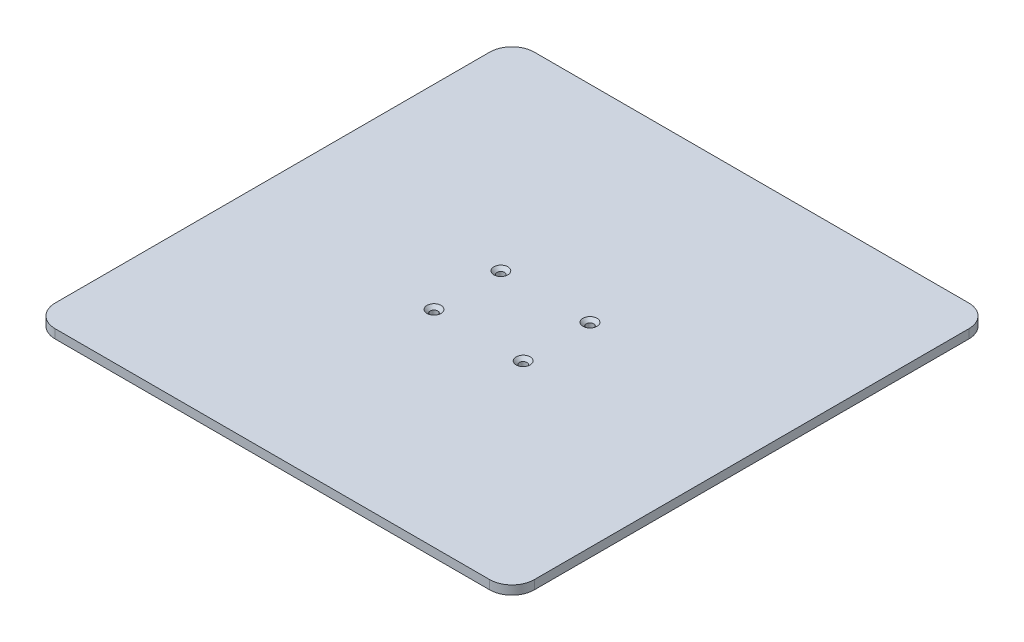
ISO-10303-21;
HEADER;
FILE_DESCRIPTION(('STEP AP214'),'2;1');
FILE_NAME('part.step','',(''),(''),'','','');
FILE_SCHEMA(('AUTOMOTIVE_DESIGN { 1 0 10303 214 1 1 1 1 }'));
ENDSEC;
DATA;
#1=APPLICATION_CONTEXT('core data for automotive mechanical design processes');
#2=APPLICATION_PROTOCOL_DEFINITION('international standard','automotive_design',2000,#1);
#3=PRODUCT_CONTEXT('',#1,'mechanical');
#4=PRODUCT('Part','Part','',(#3));
#5=PRODUCT_RELATED_PRODUCT_CATEGORY('part','',(#4));
#6=PRODUCT_DEFINITION_FORMATION('','',#4);
#7=PRODUCT_DEFINITION_CONTEXT('part definition',#1,'design');
#8=PRODUCT_DEFINITION('design','',#6,#7);
#9=PRODUCT_DEFINITION_SHAPE('','',#8);
#10=(LENGTH_UNIT() NAMED_UNIT(*) SI_UNIT(.MILLI.,.METRE.));
#11=(NAMED_UNIT(*) PLANE_ANGLE_UNIT() SI_UNIT($,.RADIAN.));
#12=(NAMED_UNIT(*) SI_UNIT($,.STERADIAN.) SOLID_ANGLE_UNIT());
#13=UNCERTAINTY_MEASURE_WITH_UNIT(LENGTH_MEASURE(1.E-05),#10,'distance_accuracy_value','');
#14=(GEOMETRIC_REPRESENTATION_CONTEXT(3) GLOBAL_UNCERTAINTY_ASSIGNED_CONTEXT((#13)) GLOBAL_UNIT_ASSIGNED_CONTEXT((#10,
#11,#12)) REPRESENTATION_CONTEXT('',''));
#15=CARTESIAN_POINT('',(0.,0.,0.));
#16=DIRECTION('',(0.,0.,1.));
#17=DIRECTION('',(1.,0.,0.));
#18=AXIS2_PLACEMENT_3D('',#15,#16,#17);
#19=CARTESIAN_POINT('',(107.5,2.,107.5));
#20=DIRECTION('',(-1.,0.,0.));
#21=DIRECTION('',(0.,0.,1.));
#22=AXIS2_PLACEMENT_3D('',#19,#20,#21);
#23=PLANE('',#22);
#24=DIRECTION('',(0.,0.,-1.));
#25=VECTOR('',#24,1.);
#26=CARTESIAN_POINT('',(107.5,2.,107.5));
#27=LINE('',#26,#25);
#28=CARTESIAN_POINT('',(107.5,2.,97.5));
#29=VERTEX_POINT('',#28);
#30=CARTESIAN_POINT('',(107.5,2.,-97.5));
#31=VERTEX_POINT('',#30);
#32=EDGE_CURVE('E139',#29,#31,#27,.T.);
#33=ORIENTED_EDGE('',*,*,#32,.F.);
#34=DIRECTION('',(0.,-1.,0.));
#35=VECTOR('',#34,1.);
#36=CARTESIAN_POINT('',(107.5,2.,97.5));
#37=LINE('',#36,#35);
#38=CARTESIAN_POINT('',(107.5,-2.,97.5));
#39=VERTEX_POINT('',#38);
#40=EDGE_CURVE('E178',#29,#39,#37,.T.);
#41=ORIENTED_EDGE('',*,*,#40,.T.);
#42=DIRECTION('',(0.,0.,-1.));
#43=VECTOR('',#42,1.);
#44=CARTESIAN_POINT('',(107.5,-2.,107.5));
#45=LINE('',#44,#43);
#46=CARTESIAN_POINT('',(107.5,-2.,-97.5));
#47=VERTEX_POINT('',#46);
#48=EDGE_CURVE('E193',#39,#47,#45,.T.);
#49=ORIENTED_EDGE('',*,*,#48,.T.);
#50=DIRECTION('',(0.,-1.,0.));
#51=VECTOR('',#50,1.);
#52=CARTESIAN_POINT('',(107.5,2.,-97.5));
#53=LINE('',#52,#51);
#54=EDGE_CURVE('E175',#47,#31,#53,.F.);
#55=ORIENTED_EDGE('',*,*,#54,.T.);
#56=EDGE_LOOP('',(#33,#41,#49,#55));
#57=FACE_BOUND('',#56,.T.);
#58=ADVANCED_FACE('F43',(#57),#23,.F.);
#59=CARTESIAN_POINT('',(-107.5,2.,-107.5));
#60=DIRECTION('',(0.,0.,1.));
#61=DIRECTION('',(1.,0.,0.));
#62=AXIS2_PLACEMENT_3D('',#59,#60,#61);
#63=PLANE('',#62);
#64=DIRECTION('',(-1.,0.,0.));
#65=VECTOR('',#64,1.);
#66=CARTESIAN_POINT('',(-107.5,2.,-107.5));
#67=LINE('',#66,#65);
#68=CARTESIAN_POINT('',(97.5,2.,-107.5));
#69=VERTEX_POINT('',#68);
#70=CARTESIAN_POINT('',(-97.5,2.,-107.5));
#71=VERTEX_POINT('',#70);
#72=EDGE_CURVE('E144',#69,#71,#67,.T.);
#73=ORIENTED_EDGE('',*,*,#72,.F.);
#74=DIRECTION('',(0.,-1.,0.));
#75=VECTOR('',#74,1.);
#76=CARTESIAN_POINT('',(97.5,2.,-107.5));
#77=LINE('',#76,#75);
#78=CARTESIAN_POINT('',(97.5,-2.,-107.5));
#79=VERTEX_POINT('',#78);
#80=EDGE_CURVE('E11',#69,#79,#77,.T.);
#81=ORIENTED_EDGE('',*,*,#80,.T.);
#82=DIRECTION('',(-1.,0.,0.));
#83=VECTOR('',#82,1.);
#84=CARTESIAN_POINT('',(-107.5,-2.,-107.5));
#85=LINE('',#84,#83);
#86=CARTESIAN_POINT('',(-97.5,-2.,-107.5));
#87=VERTEX_POINT('',#86);
#88=EDGE_CURVE('E146',#79,#87,#85,.T.);
#89=ORIENTED_EDGE('',*,*,#88,.T.);
#90=DIRECTION('',(0.,-1.,0.));
#91=VECTOR('',#90,1.);
#92=CARTESIAN_POINT('',(-97.5,2.,-107.5));
#93=LINE('',#92,#91);
#94=EDGE_CURVE('E52',#87,#71,#93,.F.);
#95=ORIENTED_EDGE('',*,*,#94,.T.);
#96=EDGE_LOOP('',(#73,#81,#89,#95));
#97=FACE_BOUND('',#96,.T.);
#98=ADVANCED_FACE('F199',(#97),#63,.F.);
#99=CARTESIAN_POINT('',(-107.5,2.,107.5));
#100=DIRECTION('',(1.,0.,0.));
#101=DIRECTION('',(0.,0.,-1.));
#102=AXIS2_PLACEMENT_3D('',#99,#100,#101);
#103=PLANE('',#102);
#104=DIRECTION('',(0.,0.,1.));
#105=VECTOR('',#104,1.);
#106=CARTESIAN_POINT('',(-107.5,-2.,107.5));
#107=LINE('',#106,#105);
#108=CARTESIAN_POINT('',(-107.5,-2.,-97.5));
#109=VERTEX_POINT('',#108);
#110=CARTESIAN_POINT('',(-107.5,-2.,97.5));
#111=VERTEX_POINT('',#110);
#112=EDGE_CURVE('E140',#109,#111,#107,.T.);
#113=ORIENTED_EDGE('',*,*,#112,.T.);
#114=DIRECTION('',(0.,-1.,0.));
#115=VECTOR('',#114,1.);
#116=CARTESIAN_POINT('',(-107.5,2.,97.5));
#117=LINE('',#116,#115);
#118=CARTESIAN_POINT('',(-107.5,2.,97.5));
#119=VERTEX_POINT('',#118);
#120=EDGE_CURVE('E115',#111,#119,#117,.F.);
#121=ORIENTED_EDGE('',*,*,#120,.T.);
#122=DIRECTION('',(0.,0.,1.));
#123=VECTOR('',#122,1.);
#124=CARTESIAN_POINT('',(-107.5,2.,107.5));
#125=LINE('',#124,#123);
#126=CARTESIAN_POINT('',(-107.5,2.,-97.5));
#127=VERTEX_POINT('',#126);
#128=EDGE_CURVE('E184',#127,#119,#125,.T.);
#129=ORIENTED_EDGE('',*,*,#128,.F.);
#130=DIRECTION('',(0.,-1.,0.));
#131=VECTOR('',#130,1.);
#132=CARTESIAN_POINT('',(-107.5,2.,-97.5));
#133=LINE('',#132,#131);
#134=EDGE_CURVE('E121',#127,#109,#133,.T.);
#135=ORIENTED_EDGE('',*,*,#134,.T.);
#136=EDGE_LOOP('',(#113,#121,#129,#135));
#137=FACE_BOUND('',#136,.T.);
#138=ADVANCED_FACE('F206',(#137),#103,.F.);
#139=CARTESIAN_POINT('',(-107.5,2.,107.5));
#140=DIRECTION('',(0.,0.,-1.));
#141=DIRECTION('',(-1.,0.,0.));
#142=AXIS2_PLACEMENT_3D('',#139,#140,#141);
#143=PLANE('',#142);
#144=DIRECTION('',(1.,0.,0.));
#145=VECTOR('',#144,1.);
#146=CARTESIAN_POINT('',(-107.5,2.,107.5));
#147=LINE('',#146,#145);
#148=CARTESIAN_POINT('',(-97.5,2.,107.5));
#149=VERTEX_POINT('',#148);
#150=CARTESIAN_POINT('',(97.5,2.,107.5));
#151=VERTEX_POINT('',#150);
#152=EDGE_CURVE('E131',#149,#151,#147,.T.);
#153=ORIENTED_EDGE('',*,*,#152,.F.);
#154=DIRECTION('',(0.,-1.,0.));
#155=VECTOR('',#154,1.);
#156=CARTESIAN_POINT('',(-97.5,2.,107.5));
#157=LINE('',#156,#155);
#158=CARTESIAN_POINT('',(-97.5,-2.,107.5));
#159=VERTEX_POINT('',#158);
#160=EDGE_CURVE('E114',#149,#159,#157,.T.);
#161=ORIENTED_EDGE('',*,*,#160,.T.);
#162=DIRECTION('',(1.,0.,0.));
#163=VECTOR('',#162,1.);
#164=CARTESIAN_POINT('',(-107.5,-2.,107.5));
#165=LINE('',#164,#163);
#166=CARTESIAN_POINT('',(97.5,-2.,107.5));
#167=VERTEX_POINT('',#166);
#168=EDGE_CURVE('E128',#159,#167,#165,.T.);
#169=ORIENTED_EDGE('',*,*,#168,.T.);
#170=DIRECTION('',(0.,-1.,0.));
#171=VECTOR('',#170,1.);
#172=CARTESIAN_POINT('',(97.5,2.,107.5));
#173=LINE('',#172,#171);
#174=EDGE_CURVE('E134',#167,#151,#173,.F.);
#175=ORIENTED_EDGE('',*,*,#174,.T.);
#176=EDGE_LOOP('',(#153,#161,#169,#175));
#177=FACE_BOUND('',#176,.T.);
#178=ADVANCED_FACE('F127',(#177),#143,.F.);
#179=CARTESIAN_POINT('',(0.,2.,0.));
#180=DIRECTION('',(0.,-1.,0.));
#181=DIRECTION('',(0.,0.,-1.));
#182=AXIS2_PLACEMENT_3D('',#179,#180,#181);
#183=PLANE('',#182);
#184=CARTESIAN_POINT('',(-20.,2.,-15.));
#185=DIRECTION('',(0.,1.,0.));
#186=DIRECTION('',(0.,0.,1.));
#187=AXIS2_PLACEMENT_3D('',#184,#185,#186);
#188=CIRCLE('',#187,3.15);
#189=CARTESIAN_POINT('',(-20.,2.,-11.85));
#190=VERTEX_POINT('',#189);
#191=EDGE_CURVE('E459',#190,#190,#188,.T.);
#192=ORIENTED_EDGE('',*,*,#191,.F.);
#193=EDGE_LOOP('',(#192));
#194=FACE_BOUND('',#193,.T.);
#195=CARTESIAN_POINT('',(20.,2.,-15.));
#196=DIRECTION('',(0.,1.,0.));
#197=DIRECTION('',(0.,0.,1.));
#198=AXIS2_PLACEMENT_3D('',#195,#196,#197);
#199=CIRCLE('',#198,3.15);
#200=CARTESIAN_POINT('',(20.,2.,-11.85));
#201=VERTEX_POINT('',#200);
#202=EDGE_CURVE('E447',#201,#201,#199,.T.);
#203=ORIENTED_EDGE('',*,*,#202,.F.);
#204=EDGE_LOOP('',(#203));
#205=FACE_BOUND('',#204,.T.);
#206=CARTESIAN_POINT('',(20.,2.,15.));
#207=DIRECTION('',(0.,1.,0.));
#208=DIRECTION('',(0.,0.,1.));
#209=AXIS2_PLACEMENT_3D('',#206,#207,#208);
#210=CIRCLE('',#209,3.15);
#211=CARTESIAN_POINT('',(20.,2.,18.15));
#212=VERTEX_POINT('',#211);
#213=EDGE_CURVE('E435',#212,#212,#210,.T.);
#214=ORIENTED_EDGE('',*,*,#213,.F.);
#215=EDGE_LOOP('',(#214));
#216=FACE_BOUND('',#215,.T.);
#217=CARTESIAN_POINT('',(-20.,2.,15.));
#218=DIRECTION('',(0.,1.,0.));
#219=DIRECTION('',(0.,0.,1.));
#220=AXIS2_PLACEMENT_3D('',#217,#218,#219);
#221=CIRCLE('',#220,3.15);
#222=CARTESIAN_POINT('',(-20.,2.,18.15));
#223=VERTEX_POINT('',#222);
#224=EDGE_CURVE('E421',#223,#223,#221,.T.);
#225=ORIENTED_EDGE('',*,*,#224,.F.);
#226=EDGE_LOOP('',(#225));
#227=FACE_BOUND('',#226,.T.);
#228=ORIENTED_EDGE('',*,*,#128,.T.);
#229=CARTESIAN_POINT('',(-97.5,2.,97.5));
#230=DIRECTION('',(0.,-1.,0.));
#231=DIRECTION('',(0.,0.,-1.));
#232=AXIS2_PLACEMENT_3D('',#229,#230,#231);
#233=CIRCLE('',#232,10.);
#234=EDGE_CURVE('E172',#119,#149,#233,.F.);
#235=ORIENTED_EDGE('',*,*,#234,.T.);
#236=ORIENTED_EDGE('',*,*,#152,.T.);
#237=CARTESIAN_POINT('',(97.5,2.,97.5));
#238=DIRECTION('',(0.,-1.,0.));
#239=DIRECTION('',(0.,0.,-1.));
#240=AXIS2_PLACEMENT_3D('',#237,#238,#239);
#241=CIRCLE('',#240,10.);
#242=EDGE_CURVE('E169',#151,#29,#241,.F.);
#243=ORIENTED_EDGE('',*,*,#242,.T.);
#244=ORIENTED_EDGE('',*,*,#32,.T.);
#245=CARTESIAN_POINT('',(97.5,2.,-97.5));
#246=DIRECTION('',(0.,-1.,0.));
#247=DIRECTION('',(0.,0.,-1.));
#248=AXIS2_PLACEMENT_3D('',#245,#246,#247);
#249=CIRCLE('',#248,10.);
#250=EDGE_CURVE('E65',#31,#69,#249,.F.);
#251=ORIENTED_EDGE('',*,*,#250,.T.);
#252=ORIENTED_EDGE('',*,*,#72,.T.);
#253=CARTESIAN_POINT('',(-97.5,2.,-97.5));
#254=DIRECTION('',(0.,-1.,0.));
#255=DIRECTION('',(0.,0.,-1.));
#256=AXIS2_PLACEMENT_3D('',#253,#254,#255);
#257=CIRCLE('',#256,10.);
#258=EDGE_CURVE('E164',#71,#127,#257,.F.);
#259=ORIENTED_EDGE('',*,*,#258,.T.);
#260=EDGE_LOOP('',(#228,#235,#236,#243,#244,#251,#252,#259));
#261=FACE_BOUND('',#260,.T.);
#262=ADVANCED_FACE('F204',(#194,#205,#216,#227,#261),#183,.F.);
#263=CARTESIAN_POINT('',(0.,-2.,0.));
#264=DIRECTION('',(0.,-1.,0.));
#265=DIRECTION('',(0.,0.,-1.));
#266=AXIS2_PLACEMENT_3D('',#263,#264,#265);
#267=PLANE('',#266);
#268=CARTESIAN_POINT('',(-20.,-2.,-15.));
#269=DIRECTION('',(0.,-1.,0.));
#270=DIRECTION('',(0.,0.,-1.));
#271=AXIS2_PLACEMENT_3D('',#268,#269,#270);
#272=CIRCLE('',#271,1.7);
#273=CARTESIAN_POINT('',(-20.,-2.,-16.7));
#274=VERTEX_POINT('',#273);
#275=EDGE_CURVE('E451',#274,#274,#272,.T.);
#276=ORIENTED_EDGE('',*,*,#275,.F.);
#277=EDGE_LOOP('',(#276));
#278=FACE_BOUND('',#277,.T.);
#279=CARTESIAN_POINT('',(20.,-2.,-15.));
#280=DIRECTION('',(0.,-1.,0.));
#281=DIRECTION('',(0.,0.,-1.));
#282=AXIS2_PLACEMENT_3D('',#279,#280,#281);
#283=CIRCLE('',#282,1.7);
#284=CARTESIAN_POINT('',(20.,-2.,-16.7));
#285=VERTEX_POINT('',#284);
#286=EDGE_CURVE('E439',#285,#285,#283,.T.);
#287=ORIENTED_EDGE('',*,*,#286,.F.);
#288=EDGE_LOOP('',(#287));
#289=FACE_BOUND('',#288,.T.);
#290=CARTESIAN_POINT('',(20.,-2.,15.));
#291=DIRECTION('',(0.,-1.,0.));
#292=DIRECTION('',(0.,0.,-1.));
#293=AXIS2_PLACEMENT_3D('',#290,#291,#292);
#294=CIRCLE('',#293,1.7);
#295=CARTESIAN_POINT('',(20.,-2.,13.3));
#296=VERTEX_POINT('',#295);
#297=EDGE_CURVE('E427',#296,#296,#294,.T.);
#298=ORIENTED_EDGE('',*,*,#297,.F.);
#299=EDGE_LOOP('',(#298));
#300=FACE_BOUND('',#299,.T.);
#301=CARTESIAN_POINT('',(-20.,-2.,15.));
#302=DIRECTION('',(0.,-1.,0.));
#303=DIRECTION('',(0.,0.,-1.));
#304=AXIS2_PLACEMENT_3D('',#301,#302,#303);
#305=CIRCLE('',#304,1.7);
#306=CARTESIAN_POINT('',(-20.,-2.,13.3));
#307=VERTEX_POINT('',#306);
#308=EDGE_CURVE('E196',#307,#307,#305,.T.);
#309=ORIENTED_EDGE('',*,*,#308,.F.);
#310=EDGE_LOOP('',(#309));
#311=FACE_BOUND('',#310,.T.);
#312=ORIENTED_EDGE('',*,*,#168,.F.);
#313=CARTESIAN_POINT('',(-97.5,-2.,97.5));
#314=DIRECTION('',(0.,-1.,0.));
#315=DIRECTION('',(0.,0.,-1.));
#316=AXIS2_PLACEMENT_3D('',#313,#314,#315);
#317=CIRCLE('',#316,10.);
#318=EDGE_CURVE('E110',#159,#111,#317,.T.);
#319=ORIENTED_EDGE('',*,*,#318,.T.);
#320=ORIENTED_EDGE('',*,*,#112,.F.);
#321=CARTESIAN_POINT('',(-97.5,-2.,-97.5));
#322=DIRECTION('',(0.,-1.,0.));
#323=DIRECTION('',(0.,0.,-1.));
#324=AXIS2_PLACEMENT_3D('',#321,#322,#323);
#325=CIRCLE('',#324,10.);
#326=EDGE_CURVE('E133',#109,#87,#325,.T.);
#327=ORIENTED_EDGE('',*,*,#326,.T.);
#328=ORIENTED_EDGE('',*,*,#88,.F.);
#329=CARTESIAN_POINT('',(97.5,-2.,-97.5));
#330=DIRECTION('',(0.,-1.,0.));
#331=DIRECTION('',(0.,0.,-1.));
#332=AXIS2_PLACEMENT_3D('',#329,#330,#331);
#333=CIRCLE('',#332,10.);
#334=EDGE_CURVE('E154',#79,#47,#333,.T.);
#335=ORIENTED_EDGE('',*,*,#334,.T.);
#336=ORIENTED_EDGE('',*,*,#48,.F.);
#337=CARTESIAN_POINT('',(97.5,-2.,97.5));
#338=DIRECTION('',(0.,-1.,0.));
#339=DIRECTION('',(0.,0.,-1.));
#340=AXIS2_PLACEMENT_3D('',#337,#338,#339);
#341=CIRCLE('',#340,10.);
#342=EDGE_CURVE('E122',#39,#167,#341,.T.);
#343=ORIENTED_EDGE('',*,*,#342,.T.);
#344=EDGE_LOOP('',(#312,#319,#320,#327,#328,#335,#336,#343));
#345=FACE_BOUND('',#344,.T.);
#346=ADVANCED_FACE('F136',(#278,#289,#300,#311,#345),#267,.T.);
#347=CARTESIAN_POINT('',(-20.,2.,15.));
#348=DIRECTION('',(0.,1.,0.));
#349=DIRECTION('',(0.,0.,1.));
#350=AXIS2_PLACEMENT_3D('',#347,#348,#349);
#351=CYLINDRICAL_SURFACE('',#350,1.7);
#352=CARTESIAN_POINT('',(-20.,0.549999999999998,15.));
#353=DIRECTION('',(0.,1.,0.));
#354=DIRECTION('',(0.,0.,1.));
#355=AXIS2_PLACEMENT_3D('',#352,#353,#354);
#356=CIRCLE('',#355,1.7);
#357=CARTESIAN_POINT('',(-20.,0.549999999999998,16.7));
#358=VERTEX_POINT('',#357);
#359=EDGE_CURVE('E415',#358,#358,#356,.T.);
#360=ORIENTED_EDGE('',*,*,#359,.T.);
#361=EDGE_LOOP('',(#360));
#362=FACE_BOUND('',#361,.T.);
#363=ORIENTED_EDGE('',*,*,#308,.T.);
#364=EDGE_LOOP('',(#363));
#365=FACE_BOUND('',#364,.T.);
#366=ADVANCED_FACE('F270',(#362,#365),#351,.F.);
#367=CARTESIAN_POINT('',(-20.,2.,15.));
#368=DIRECTION('',(0.,1.,0.));
#369=DIRECTION('',(0.,0.,1.));
#370=AXIS2_PLACEMENT_3D('',#367,#368,#369);
#371=CONICAL_SURFACE('',#370,3.15,0.785398163397449);
#372=ORIENTED_EDGE('',*,*,#359,.F.);
#373=EDGE_LOOP('',(#372));
#374=FACE_BOUND('',#373,.T.);
#375=ORIENTED_EDGE('',*,*,#224,.T.);
#376=EDGE_LOOP('',(#375));
#377=FACE_BOUND('',#376,.T.);
#378=ADVANCED_FACE('F370',(#374,#377),#371,.F.);
#379=CARTESIAN_POINT('',(20.,2.,15.));
#380=DIRECTION('',(0.,1.,0.));
#381=DIRECTION('',(0.,0.,1.));
#382=AXIS2_PLACEMENT_3D('',#379,#380,#381);
#383=CYLINDRICAL_SURFACE('',#382,1.7);
#384=CARTESIAN_POINT('',(20.,0.549999999999998,15.));
#385=DIRECTION('',(0.,1.,0.));
#386=DIRECTION('',(0.,0.,1.));
#387=AXIS2_PLACEMENT_3D('',#384,#385,#386);
#388=CIRCLE('',#387,1.7);
#389=CARTESIAN_POINT('',(20.,0.549999999999998,16.7));
#390=VERTEX_POINT('',#389);
#391=EDGE_CURVE('E431',#390,#390,#388,.T.);
#392=ORIENTED_EDGE('',*,*,#391,.T.);
#393=EDGE_LOOP('',(#392));
#394=FACE_BOUND('',#393,.T.);
#395=ORIENTED_EDGE('',*,*,#297,.T.);
#396=EDGE_LOOP('',(#395));
#397=FACE_BOUND('',#396,.T.);
#398=ADVANCED_FACE('F359',(#394,#397),#383,.F.);
#399=CARTESIAN_POINT('',(20.,2.,15.));
#400=DIRECTION('',(0.,1.,0.));
#401=DIRECTION('',(0.,0.,1.));
#402=AXIS2_PLACEMENT_3D('',#399,#400,#401);
#403=CONICAL_SURFACE('',#402,3.15,0.785398163397449);
#404=ORIENTED_EDGE('',*,*,#391,.F.);
#405=EDGE_LOOP('',(#404));
#406=FACE_BOUND('',#405,.T.);
#407=ORIENTED_EDGE('',*,*,#213,.T.);
#408=EDGE_LOOP('',(#407));
#409=FACE_BOUND('',#408,.T.);
#410=ADVANCED_FACE('F348',(#406,#409),#403,.F.);
#411=CARTESIAN_POINT('',(20.,2.,-15.));
#412=DIRECTION('',(0.,1.,0.));
#413=DIRECTION('',(0.,0.,1.));
#414=AXIS2_PLACEMENT_3D('',#411,#412,#413);
#415=CYLINDRICAL_SURFACE('',#414,1.7);
#416=CARTESIAN_POINT('',(20.,0.549999999999998,-15.));
#417=DIRECTION('',(0.,1.,0.));
#418=DIRECTION('',(0.,0.,1.));
#419=AXIS2_PLACEMENT_3D('',#416,#417,#418);
#420=CIRCLE('',#419,1.7);
#421=CARTESIAN_POINT('',(20.,0.549999999999998,-13.3));
#422=VERTEX_POINT('',#421);
#423=EDGE_CURVE('E443',#422,#422,#420,.T.);
#424=ORIENTED_EDGE('',*,*,#423,.T.);
#425=EDGE_LOOP('',(#424));
#426=FACE_BOUND('',#425,.T.);
#427=ORIENTED_EDGE('',*,*,#286,.T.);
#428=EDGE_LOOP('',(#427));
#429=FACE_BOUND('',#428,.T.);
#430=ADVANCED_FACE('F337',(#426,#429),#415,.F.);
#431=CARTESIAN_POINT('',(20.,2.,-15.));
#432=DIRECTION('',(0.,1.,0.));
#433=DIRECTION('',(0.,0.,1.));
#434=AXIS2_PLACEMENT_3D('',#431,#432,#433);
#435=CONICAL_SURFACE('',#434,3.15,0.785398163397449);
#436=ORIENTED_EDGE('',*,*,#423,.F.);
#437=EDGE_LOOP('',(#436));
#438=FACE_BOUND('',#437,.T.);
#439=ORIENTED_EDGE('',*,*,#202,.T.);
#440=EDGE_LOOP('',(#439));
#441=FACE_BOUND('',#440,.T.);
#442=ADVANCED_FACE('F326',(#438,#441),#435,.F.);
#443=CARTESIAN_POINT('',(-20.,2.,-15.));
#444=DIRECTION('',(0.,1.,0.));
#445=DIRECTION('',(0.,0.,1.));
#446=AXIS2_PLACEMENT_3D('',#443,#444,#445);
#447=CYLINDRICAL_SURFACE('',#446,1.7);
#448=CARTESIAN_POINT('',(-20.,0.549999999999998,-15.));
#449=DIRECTION('',(0.,1.,0.));
#450=DIRECTION('',(0.,0.,1.));
#451=AXIS2_PLACEMENT_3D('',#448,#449,#450);
#452=CIRCLE('',#451,1.7);
#453=CARTESIAN_POINT('',(-20.,0.549999999999998,-13.3));
#454=VERTEX_POINT('',#453);
#455=EDGE_CURVE('E455',#454,#454,#452,.T.);
#456=ORIENTED_EDGE('',*,*,#455,.T.);
#457=EDGE_LOOP('',(#456));
#458=FACE_BOUND('',#457,.T.);
#459=ORIENTED_EDGE('',*,*,#275,.T.);
#460=EDGE_LOOP('',(#459));
#461=FACE_BOUND('',#460,.T.);
#462=ADVANCED_FACE('F315',(#458,#461),#447,.F.);
#463=CARTESIAN_POINT('',(-20.,2.,-15.));
#464=DIRECTION('',(0.,1.,0.));
#465=DIRECTION('',(0.,0.,1.));
#466=AXIS2_PLACEMENT_3D('',#463,#464,#465);
#467=CONICAL_SURFACE('',#466,3.15,0.785398163397449);
#468=ORIENTED_EDGE('',*,*,#455,.F.);
#469=EDGE_LOOP('',(#468));
#470=FACE_BOUND('',#469,.T.);
#471=ORIENTED_EDGE('',*,*,#191,.T.);
#472=EDGE_LOOP('',(#471));
#473=FACE_BOUND('',#472,.T.);
#474=ADVANCED_FACE('F225',(#470,#473),#467,.F.);
#475=CARTESIAN_POINT('',(-97.5,2.,97.5));
#476=DIRECTION('',(0.,-1.,0.));
#477=DIRECTION('',(0.,0.,-1.));
#478=AXIS2_PLACEMENT_3D('',#475,#476,#477);
#479=CYLINDRICAL_SURFACE('',#478,10.);
#480=ORIENTED_EDGE('',*,*,#234,.F.);
#481=ORIENTED_EDGE('',*,*,#120,.F.);
#482=ORIENTED_EDGE('',*,*,#318,.F.);
#483=ORIENTED_EDGE('',*,*,#160,.F.);
#484=EDGE_LOOP('',(#480,#481,#482,#483));
#485=FACE_BOUND('',#484,.T.);
#486=ADVANCED_FACE('F113',(#485),#479,.T.);
#487=CARTESIAN_POINT('',(97.5,2.,97.5));
#488=DIRECTION('',(0.,-1.,0.));
#489=DIRECTION('',(0.,0.,-1.));
#490=AXIS2_PLACEMENT_3D('',#487,#488,#489);
#491=CYLINDRICAL_SURFACE('',#490,10.);
#492=ORIENTED_EDGE('',*,*,#242,.F.);
#493=ORIENTED_EDGE('',*,*,#174,.F.);
#494=ORIENTED_EDGE('',*,*,#342,.F.);
#495=ORIENTED_EDGE('',*,*,#40,.F.);
#496=EDGE_LOOP('',(#492,#493,#494,#495));
#497=FACE_BOUND('',#496,.T.);
#498=ADVANCED_FACE('F224',(#497),#491,.T.);
#499=CARTESIAN_POINT('',(97.5,2.,-97.5));
#500=DIRECTION('',(0.,-1.,0.));
#501=DIRECTION('',(0.,0.,-1.));
#502=AXIS2_PLACEMENT_3D('',#499,#500,#501);
#503=CYLINDRICAL_SURFACE('',#502,10.);
#504=ORIENTED_EDGE('',*,*,#250,.F.);
#505=ORIENTED_EDGE('',*,*,#54,.F.);
#506=ORIENTED_EDGE('',*,*,#334,.F.);
#507=ORIENTED_EDGE('',*,*,#80,.F.);
#508=EDGE_LOOP('',(#504,#505,#506,#507));
#509=FACE_BOUND('',#508,.T.);
#510=ADVANCED_FACE('F227',(#509),#503,.T.);
#511=CARTESIAN_POINT('',(-97.5,2.,-97.5));
#512=DIRECTION('',(0.,-1.,0.));
#513=DIRECTION('',(0.,0.,-1.));
#514=AXIS2_PLACEMENT_3D('',#511,#512,#513);
#515=CYLINDRICAL_SURFACE('',#514,10.);
#516=ORIENTED_EDGE('',*,*,#258,.F.);
#517=ORIENTED_EDGE('',*,*,#94,.F.);
#518=ORIENTED_EDGE('',*,*,#326,.F.);
#519=ORIENTED_EDGE('',*,*,#134,.F.);
#520=EDGE_LOOP('',(#516,#517,#518,#519));
#521=FACE_BOUND('',#520,.T.);
#522=ADVANCED_FACE('F45',(#521),#515,.T.);
#523=CLOSED_SHELL('',(#58,#98,#138,#178,#262,#346,#366,#378,#398,#410,#430,#442,#462,#474,#486,
#498,#510,#522));
#524=MANIFOLD_SOLID_BREP('B2',#523);
#525=ADVANCED_BREP_SHAPE_REPRESENTATION('',(#18,#524),#14);
#526=SHAPE_DEFINITION_REPRESENTATION(#9,#525);
ENDSEC;
END-ISO-10303-21;
